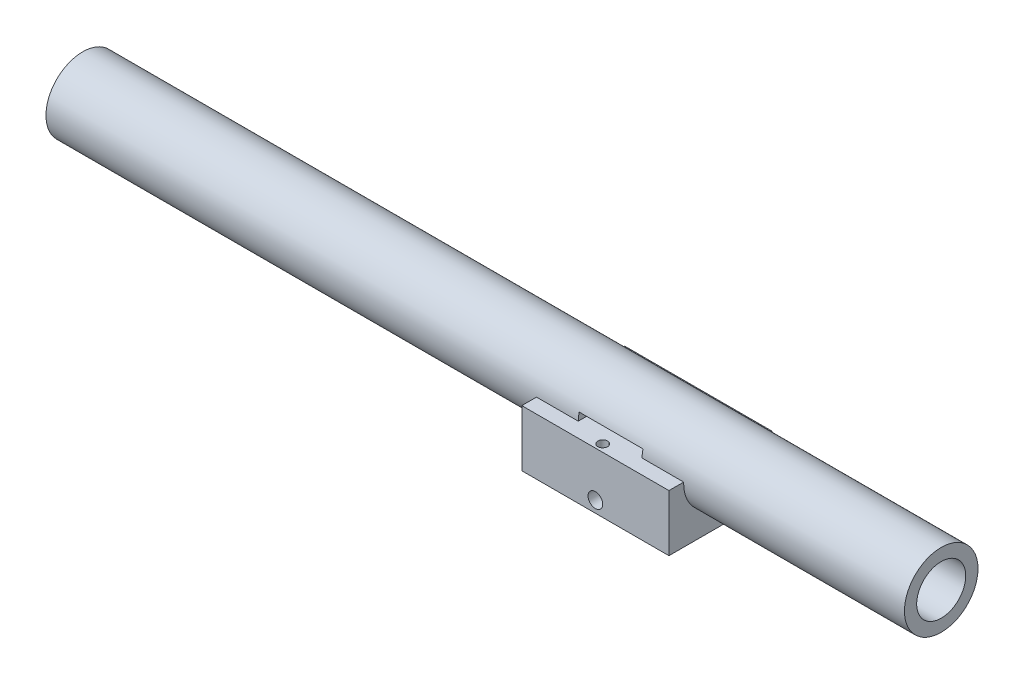
ISO-10303-21;
HEADER;
FILE_DESCRIPTION(('STEP AP214'),'2;1');
FILE_NAME('part.step','',(''),(''),'','','');
FILE_SCHEMA(('AUTOMOTIVE_DESIGN { 1 0 10303 214 1 1 1 1 }'));
ENDSEC;
DATA;
#1=APPLICATION_CONTEXT('core data for automotive mechanical design processes');
#2=APPLICATION_PROTOCOL_DEFINITION('international standard','automotive_design',2000,#1);
#3=PRODUCT_CONTEXT('',#1,'mechanical');
#4=PRODUCT('Part','Part','',(#3));
#5=PRODUCT_RELATED_PRODUCT_CATEGORY('part','',(#4));
#6=PRODUCT_DEFINITION_FORMATION('','',#4);
#7=PRODUCT_DEFINITION_CONTEXT('part definition',#1,'design');
#8=PRODUCT_DEFINITION('design','',#6,#7);
#9=PRODUCT_DEFINITION_SHAPE('','',#8);
#10=(LENGTH_UNIT() NAMED_UNIT(*) SI_UNIT(.MILLI.,.METRE.));
#11=(NAMED_UNIT(*) PLANE_ANGLE_UNIT() SI_UNIT($,.RADIAN.));
#12=(NAMED_UNIT(*) SI_UNIT($,.STERADIAN.) SOLID_ANGLE_UNIT());
#13=UNCERTAINTY_MEASURE_WITH_UNIT(LENGTH_MEASURE(1.E-05),#10,'distance_accuracy_value','');
#14=(GEOMETRIC_REPRESENTATION_CONTEXT(3) GLOBAL_UNCERTAINTY_ASSIGNED_CONTEXT((#13)) GLOBAL_UNIT_ASSIGNED_CONTEXT((#10,
#11,#12)) REPRESENTATION_CONTEXT('',''));
#15=CARTESIAN_POINT('',(0.,0.,0.));
#16=DIRECTION('',(0.,0.,1.));
#17=DIRECTION('',(1.,0.,0.));
#18=AXIS2_PLACEMENT_3D('',#15,#16,#17);
#19=CARTESIAN_POINT('',(44.45,15.0494836321337,37.2907559026321));
#20=DIRECTION('',(1.,0.,0.));
#21=DIRECTION('',(0.,0.,-1.));
#22=AXIS2_PLACEMENT_3D('',#19,#20,#21);
#23=PLANE('',#22);
#24=CARTESIAN_POINT('',(44.45,15.0494836321337,37.2907559026321));
#25=DIRECTION('',(1.,0.,0.));
#26=DIRECTION('',(0.,0.,-1.));
#27=AXIS2_PLACEMENT_3D('',#24,#25,#26);
#28=CIRCLE('',#27,1.90500000000001);
#29=CARTESIAN_POINT('',(44.45,15.0494836321337,35.3857559026321));
#30=VERTEX_POINT('',#29);
#31=EDGE_CURVE('E152',#30,#30,#28,.T.);
#32=ORIENTED_EDGE('',*,*,#31,.T.);
#33=EDGE_LOOP('',(#32));
#34=FACE_BOUND('',#33,.T.);
#35=CARTESIAN_POINT('',(44.45,15.0494836321337,37.2907559026321));
#36=DIRECTION('',(1.,0.,0.));
#37=DIRECTION('',(0.,0.,-1.));
#38=AXIS2_PLACEMENT_3D('',#35,#36,#37);
#39=CIRCLE('',#38,1.27);
#40=CARTESIAN_POINT('',(44.45,15.0494836321337,36.0207559026321));
#41=VERTEX_POINT('',#40);
#42=EDGE_CURVE('E146',#41,#41,#39,.T.);
#43=ORIENTED_EDGE('',*,*,#42,.F.);
#44=EDGE_LOOP('',(#43));
#45=FACE_BOUND('',#44,.T.);
#46=ADVANCED_FACE('F32',(#34,#45),#23,.T.);
#47=CARTESIAN_POINT('',(0.,15.0494836321337,37.2907559026321));
#48=DIRECTION('',(1.,0.,0.));
#49=DIRECTION('',(0.,0.,-1.));
#50=AXIS2_PLACEMENT_3D('',#47,#48,#49);
#51=PLANE('',#50);
#52=CARTESIAN_POINT('',(0.,15.0494836321337,37.2907559026321));
#53=DIRECTION('',(1.,0.,0.));
#54=DIRECTION('',(0.,0.,-1.));
#55=AXIS2_PLACEMENT_3D('',#52,#53,#54);
#56=CIRCLE('',#55,1.90500000000001);
#57=CARTESIAN_POINT('',(0.,15.0494836321337,35.3857559026321));
#58=VERTEX_POINT('',#57);
#59=EDGE_CURVE('E149',#58,#58,#56,.T.);
#60=ORIENTED_EDGE('',*,*,#59,.F.);
#61=EDGE_LOOP('',(#60));
#62=FACE_BOUND('',#61,.T.);
#63=CARTESIAN_POINT('',(0.,15.0494836321337,37.2907559026321));
#64=DIRECTION('',(1.,0.,0.));
#65=DIRECTION('',(0.,0.,-1.));
#66=AXIS2_PLACEMENT_3D('',#63,#64,#65);
#67=CIRCLE('',#66,1.27);
#68=CARTESIAN_POINT('',(0.,15.0494836321337,36.0207559026321));
#69=VERTEX_POINT('',#68);
#70=EDGE_CURVE('E145',#69,#69,#67,.T.);
#71=ORIENTED_EDGE('',*,*,#70,.T.);
#72=EDGE_LOOP('',(#71));
#73=FACE_BOUND('',#72,.T.);
#74=ADVANCED_FACE('F232',(#62,#73),#51,.F.);
#75=CARTESIAN_POINT('',(44.45,15.0494836321337,37.2907559026321));
#76=DIRECTION('',(-1.,0.,0.));
#77=DIRECTION('',(0.,0.,1.));
#78=AXIS2_PLACEMENT_3D('',#75,#76,#77);
#79=CYLINDRICAL_SURFACE('',#78,1.90500000000001);
#80=DIRECTION('',(-1.,0.,0.));
#81=VECTOR('',#80,1.);
#82=CARTESIAN_POINT('',(44.45,15.1201343526344,39.1944453404588));
#83=LINE('',#82,#81);
#84=CARTESIAN_POINT('',(25.4,15.1201343526344,39.1944453404588));
#85=VERTEX_POINT('',#84);
#86=CARTESIAN_POINT('',(27.559,15.1201343526344,39.1944453404588));
#87=VERTEX_POINT('',#86);
#88=EDGE_CURVE('E130',#85,#87,#83,.F.);
#89=ORIENTED_EDGE('',*,*,#88,.T.);
#90=CARTESIAN_POINT('',(27.559,15.0494836321337,37.2907559026321));
#91=DIRECTION('',(-1.,0.,0.));
#92=DIRECTION('',(0.,0.,1.));
#93=AXIS2_PLACEMENT_3D('',#90,#91,#92);
#94=CIRCLE('',#93,1.90500000000001);
#95=CARTESIAN_POINT('',(27.559,15.5011343526344,39.1414413504247));
#96=VERTEX_POINT('',#95);
#97=EDGE_CURVE('E162',#87,#96,#94,.T.);
#98=ORIENTED_EDGE('',*,*,#97,.T.);
#99=DIRECTION('',(-1.,0.,0.));
#100=VECTOR('',#99,1.);
#101=CARTESIAN_POINT('',(44.45,15.5011343526344,39.1414413504247));
#102=LINE('',#101,#100);
#103=CARTESIAN_POINT('',(30.861,15.5011343526344,39.1414413504247));
#104=VERTEX_POINT('',#103);
#105=EDGE_CURVE('E123',#96,#104,#102,.F.);
#106=ORIENTED_EDGE('',*,*,#105,.T.);
#107=CARTESIAN_POINT('',(30.861,15.0494836321337,37.2907559026321));
#108=DIRECTION('',(1.,0.,0.));
#109=DIRECTION('',(0.,1.,0.));
#110=AXIS2_PLACEMENT_3D('',#107,#108,#109);
#111=CIRCLE('',#110,1.90500000000001);
#112=CARTESIAN_POINT('',(30.861,15.1201343526344,39.1944453404588));
#113=VERTEX_POINT('',#112);
#114=EDGE_CURVE('E108',#104,#113,#111,.T.);
#115=ORIENTED_EDGE('',*,*,#114,.T.);
#116=CARTESIAN_POINT('',(33.02,15.1201343526344,39.1944453404588));
#117=VERTEX_POINT('',#116);
#118=EDGE_CURVE('E120',#113,#117,#83,.F.);
#119=ORIENTED_EDGE('',*,*,#118,.T.);
#120=CARTESIAN_POINT('',(33.02,15.0494836321337,37.2907559026321));
#121=DIRECTION('',(-1.,0.,0.));
#122=DIRECTION('',(0.,0.,1.));
#123=AXIS2_PLACEMENT_3D('',#120,#121,#122);
#124=CIRCLE('',#123,1.90500000000001);
#125=CARTESIAN_POINT('',(33.02,15.1201343526344,35.3870664648055));
#126=VERTEX_POINT('',#125);
#127=EDGE_CURVE('E143',#126,#117,#124,.T.);
#128=ORIENTED_EDGE('',*,*,#127,.F.);
#129=DIRECTION('',(-1.,0.,0.));
#130=VECTOR('',#129,1.);
#131=CARTESIAN_POINT('',(44.45,15.1201343526344,35.3870664648055));
#132=LINE('',#131,#130);
#133=CARTESIAN_POINT('',(25.4,15.1201343526344,35.3870664648055));
#134=VERTEX_POINT('',#133);
#135=EDGE_CURVE('E133',#126,#134,#132,.T.);
#136=ORIENTED_EDGE('',*,*,#135,.T.);
#137=CARTESIAN_POINT('',(25.4,15.0494836321337,37.2907559026321));
#138=DIRECTION('',(-1.,0.,0.));
#139=DIRECTION('',(0.,-1.,0.));
#140=AXIS2_PLACEMENT_3D('',#137,#138,#139);
#141=CIRCLE('',#140,1.90500000000001);
#142=EDGE_CURVE('E140',#134,#85,#141,.T.);
#143=ORIENTED_EDGE('',*,*,#142,.T.);
#144=EDGE_LOOP('',(#89,#98,#106,#115,#119,#128,#136,#143));
#145=FACE_BOUND('',#144,.T.);
#146=ORIENTED_EDGE('',*,*,#31,.F.);
#147=EDGE_LOOP('',(#146));
#148=FACE_BOUND('',#147,.T.);
#149=ORIENTED_EDGE('',*,*,#59,.T.);
#150=EDGE_LOOP('',(#149));
#151=FACE_BOUND('',#150,.T.);
#152=ADVANCED_FACE('F34',(#145,#148,#151),#79,.T.);
#153=CARTESIAN_POINT('',(44.45,15.0494836321337,37.2907559026321));
#154=DIRECTION('',(-1.,0.,0.));
#155=DIRECTION('',(0.,0.,1.));
#156=AXIS2_PLACEMENT_3D('',#153,#154,#155);
#157=CYLINDRICAL_SURFACE('',#156,1.27);
#158=CARTESIAN_POINT('',(27.559,15.0494836321337,37.2907559026321));
#159=DIRECTION('',(-1.,0.,0.));
#160=DIRECTION('',(0.,0.,1.));
#161=AXIS2_PLACEMENT_3D('',#158,#159,#160);
#162=CIRCLE('',#161,1.27);
#163=CARTESIAN_POINT('',(27.559,15.1201343526344,38.558789212799));
#164=VERTEX_POINT('',#163);
#165=CARTESIAN_POINT('',(27.559,15.5011343526344,38.4777317350193));
#166=VERTEX_POINT('',#165);
#167=EDGE_CURVE('E124',#164,#166,#162,.T.);
#168=ORIENTED_EDGE('',*,*,#167,.F.);
#169=DIRECTION('',(-1.,0.,0.));
#170=VECTOR('',#169,1.);
#171=CARTESIAN_POINT('',(44.45,15.1201343526344,38.558789212799));
#172=LINE('',#171,#170);
#173=CARTESIAN_POINT('',(30.861,15.1201343526344,38.558789212799));
#174=VERTEX_POINT('',#173);
#175=EDGE_CURVE('E40',#174,#164,#172,.T.);
#176=ORIENTED_EDGE('',*,*,#175,.F.);
#177=CARTESIAN_POINT('',(30.861,15.0494836321337,37.2907559026321));
#178=DIRECTION('',(1.,0.,0.));
#179=DIRECTION('',(0.,1.,0.));
#180=AXIS2_PLACEMENT_3D('',#177,#178,#179);
#181=CIRCLE('',#180,1.27);
#182=CARTESIAN_POINT('',(30.861,15.5011343526344,38.4777317350193));
#183=VERTEX_POINT('',#182);
#184=EDGE_CURVE('E111',#183,#174,#181,.T.);
#185=ORIENTED_EDGE('',*,*,#184,.F.);
#186=DIRECTION('',(-1.,0.,0.));
#187=VECTOR('',#186,1.);
#188=CARTESIAN_POINT('',(44.45,15.5011343526344,38.4777317350193));
#189=LINE('',#188,#187);
#190=EDGE_CURVE('E11',#166,#183,#189,.F.);
#191=ORIENTED_EDGE('',*,*,#190,.F.);
#192=EDGE_LOOP('',(#168,#176,#185,#191));
#193=FACE_BOUND('',#192,.T.);
#194=ORIENTED_EDGE('',*,*,#42,.T.);
#195=EDGE_LOOP('',(#194));
#196=FACE_BOUND('',#195,.T.);
#197=ORIENTED_EDGE('',*,*,#70,.F.);
#198=EDGE_LOOP('',(#197));
#199=FACE_BOUND('',#198,.T.);
#200=ADVANCED_FACE('F166',(#193,#196,#199),#157,.F.);
#201=CARTESIAN_POINT('',(32.385,15.1201343526344,34.6237559026321));
#202=DIRECTION('',(0.,1.,0.));
#203=DIRECTION('',(0.,0.,1.));
#204=AXIS2_PLACEMENT_3D('',#201,#202,#203);
#205=PLANE('',#204);
#206=ORIENTED_EDGE('',*,*,#135,.F.);
#207=DIRECTION('',(0.,0.,1.));
#208=VECTOR('',#207,1.);
#209=CARTESIAN_POINT('',(33.02,15.1201343526344,34.6237559026321));
#210=LINE('',#209,#208);
#211=CARTESIAN_POINT('',(33.02,15.1201343526344,34.6237559026321));
#212=VERTEX_POINT('',#211);
#213=EDGE_CURVE('E131',#212,#126,#210,.T.);
#214=ORIENTED_EDGE('',*,*,#213,.F.);
#215=DIRECTION('',(1.,0.,0.));
#216=VECTOR('',#215,1.);
#217=CARTESIAN_POINT('',(32.385,15.1201343526344,34.6237559026321));
#218=LINE('',#217,#216);
#219=CARTESIAN_POINT('',(25.4,15.1201343526344,34.6237559026321));
#220=VERTEX_POINT('',#219);
#221=EDGE_CURVE('E184',#220,#212,#218,.T.);
#222=ORIENTED_EDGE('',*,*,#221,.F.);
#223=DIRECTION('',(0.,0.,1.));
#224=VECTOR('',#223,1.);
#225=CARTESIAN_POINT('',(25.4,15.1201343526344,34.6237559026321));
#226=LINE('',#225,#224);
#227=EDGE_CURVE('E196',#220,#134,#226,.T.);
#228=ORIENTED_EDGE('',*,*,#227,.T.);
#229=EDGE_LOOP('',(#206,#214,#222,#228));
#230=FACE_BOUND('',#229,.T.);
#231=ADVANCED_FACE('F217',(#230),#205,.T.);
#232=CARTESIAN_POINT('',(29.21,15.1201343526344,39.5767559026322));
#233=DIRECTION('',(0.,1.,0.));
#234=DIRECTION('',(0.,0.,1.));
#235=AXIS2_PLACEMENT_3D('',#232,#233,#234);
#236=CIRCLE('',#235,0.254000000000002);
#237=CARTESIAN_POINT('',(29.21,15.1201343526344,39.8307559026321));
#238=VERTEX_POINT('',#237);
#239=EDGE_CURVE('E395',#238,#238,#236,.T.);
#240=ORIENTED_EDGE('',*,*,#239,.F.);
#241=EDGE_LOOP('',(#240));
#242=FACE_BOUND('',#241,.T.);
#243=ORIENTED_EDGE('',*,*,#118,.F.);
#244=DIRECTION('',(0.,0.,1.));
#245=VECTOR('',#244,1.);
#246=CARTESIAN_POINT('',(30.861,15.1201343526344,38.1797559026322));
#247=LINE('',#246,#245);
#248=EDGE_CURVE('E47',#174,#113,#247,.T.);
#249=ORIENTED_EDGE('',*,*,#248,.F.);
#250=ORIENTED_EDGE('',*,*,#175,.T.);
#251=DIRECTION('',(0.,0.,1.));
#252=VECTOR('',#251,1.);
#253=CARTESIAN_POINT('',(27.559,15.1201343526344,38.1797559026322));
#254=LINE('',#253,#252);
#255=EDGE_CURVE('E53',#164,#87,#254,.T.);
#256=ORIENTED_EDGE('',*,*,#255,.T.);
#257=ORIENTED_EDGE('',*,*,#88,.F.);
#258=CARTESIAN_POINT('',(25.4,15.1201343526344,39.9577559026321));
#259=VERTEX_POINT('',#258);
#260=EDGE_CURVE('E195',#85,#259,#226,.T.);
#261=ORIENTED_EDGE('',*,*,#260,.T.);
#262=DIRECTION('',(1.,0.,0.));
#263=VECTOR('',#262,1.);
#264=CARTESIAN_POINT('',(32.385,15.1201343526344,39.9577559026321));
#265=LINE('',#264,#263);
#266=CARTESIAN_POINT('',(33.02,15.1201343526344,39.9577559026321));
#267=VERTEX_POINT('',#266);
#268=EDGE_CURVE('E173',#259,#267,#265,.T.);
#269=ORIENTED_EDGE('',*,*,#268,.T.);
#270=EDGE_CURVE('E128',#117,#267,#210,.T.);
#271=ORIENTED_EDGE('',*,*,#270,.F.);
#272=EDGE_LOOP('',(#243,#249,#250,#256,#257,#261,#269,#271));
#273=FACE_BOUND('',#272,.T.);
#274=ADVANCED_FACE('F126',(#242,#273),#205,.T.);
#275=CARTESIAN_POINT('',(33.02,15.1201343526344,34.6237559026321));
#276=DIRECTION('',(-1.,0.,0.));
#277=DIRECTION('',(0.,0.,1.));
#278=AXIS2_PLACEMENT_3D('',#275,#276,#277);
#279=PLANE('',#278);
#280=ORIENTED_EDGE('',*,*,#213,.T.);
#281=ORIENTED_EDGE('',*,*,#127,.T.);
#282=ORIENTED_EDGE('',*,*,#270,.T.);
#283=DIRECTION('',(0.,-1.,0.));
#284=VECTOR('',#283,1.);
#285=CARTESIAN_POINT('',(33.02,15.1201343526344,39.9577559026321));
#286=LINE('',#285,#284);
#287=CARTESIAN_POINT('',(33.02,12.1991343526344,39.9577559026321));
#288=VERTEX_POINT('',#287);
#289=EDGE_CURVE('E175',#267,#288,#286,.T.);
#290=ORIENTED_EDGE('',*,*,#289,.T.);
#291=DIRECTION('',(0.,0.,1.));
#292=VECTOR('',#291,1.);
#293=CARTESIAN_POINT('',(33.02,12.1991343526344,34.6237559026321));
#294=LINE('',#293,#292);
#295=CARTESIAN_POINT('',(33.02,12.1991343526344,34.6237559026321));
#296=VERTEX_POINT('',#295);
#297=EDGE_CURVE('E200',#296,#288,#294,.T.);
#298=ORIENTED_EDGE('',*,*,#297,.F.);
#299=DIRECTION('',(0.,-1.,0.));
#300=VECTOR('',#299,1.);
#301=CARTESIAN_POINT('',(33.02,15.1201343526344,34.6237559026321));
#302=LINE('',#301,#300);
#303=EDGE_CURVE('E187',#212,#296,#302,.T.);
#304=ORIENTED_EDGE('',*,*,#303,.F.);
#305=EDGE_LOOP('',(#280,#281,#282,#290,#298,#304));
#306=FACE_BOUND('',#305,.T.);
#307=ADVANCED_FACE('F206',(#306),#279,.F.);
#308=CARTESIAN_POINT('',(25.4,12.1991343526344,34.6237559026321));
#309=DIRECTION('',(0.,-1.,0.));
#310=DIRECTION('',(0.,0.,-1.));
#311=AXIS2_PLACEMENT_3D('',#308,#309,#310);
#312=PLANE('',#311);
#313=ORIENTED_EDGE('',*,*,#297,.T.);
#314=DIRECTION('',(1.,0.,0.));
#315=VECTOR('',#314,1.);
#316=CARTESIAN_POINT('',(25.4,12.1991343526344,39.9577559026321));
#317=LINE('',#316,#315);
#318=CARTESIAN_POINT('',(25.4,12.1991343526344,39.9577559026321));
#319=VERTEX_POINT('',#318);
#320=EDGE_CURVE('E178',#319,#288,#317,.T.);
#321=ORIENTED_EDGE('',*,*,#320,.F.);
#322=DIRECTION('',(0.,0.,1.));
#323=VECTOR('',#322,1.);
#324=CARTESIAN_POINT('',(25.4,12.1991343526344,34.6237559026321));
#325=LINE('',#324,#323);
#326=CARTESIAN_POINT('',(25.4,12.1991343526344,34.6237559026321));
#327=VERTEX_POINT('',#326);
#328=EDGE_CURVE('E199',#327,#319,#325,.T.);
#329=ORIENTED_EDGE('',*,*,#328,.F.);
#330=DIRECTION('',(1.,0.,0.));
#331=VECTOR('',#330,1.);
#332=CARTESIAN_POINT('',(25.4,12.1991343526344,34.6237559026321));
#333=LINE('',#332,#331);
#334=EDGE_CURVE('E189',#327,#296,#333,.T.);
#335=ORIENTED_EDGE('',*,*,#334,.T.);
#336=EDGE_LOOP('',(#313,#321,#329,#335));
#337=FACE_BOUND('',#336,.T.);
#338=ADVANCED_FACE('F222',(#337),#312,.T.);
#339=CARTESIAN_POINT('',(25.4,15.1201343526344,34.6237559026321));
#340=DIRECTION('',(-1.,0.,0.));
#341=DIRECTION('',(0.,-1.,0.));
#342=AXIS2_PLACEMENT_3D('',#339,#340,#341);
#343=PLANE('',#342);
#344=ORIENTED_EDGE('',*,*,#142,.F.);
#345=ORIENTED_EDGE('',*,*,#227,.F.);
#346=DIRECTION('',(0.,-1.,0.));
#347=VECTOR('',#346,1.);
#348=CARTESIAN_POINT('',(25.4,15.1201343526344,34.6237559026321));
#349=LINE('',#348,#347);
#350=EDGE_CURVE('E192',#220,#327,#349,.T.);
#351=ORIENTED_EDGE('',*,*,#350,.T.);
#352=ORIENTED_EDGE('',*,*,#328,.T.);
#353=DIRECTION('',(0.,-1.,0.));
#354=VECTOR('',#353,1.);
#355=CARTESIAN_POINT('',(25.4,15.1201343526344,39.9577559026321));
#356=LINE('',#355,#354);
#357=EDGE_CURVE('E181',#259,#319,#356,.T.);
#358=ORIENTED_EDGE('',*,*,#357,.F.);
#359=ORIENTED_EDGE('',*,*,#260,.F.);
#360=EDGE_LOOP('',(#344,#345,#351,#352,#358,#359));
#361=FACE_BOUND('',#360,.T.);
#362=ADVANCED_FACE('F213',(#361),#343,.T.);
#363=CARTESIAN_POINT('',(0.,0.,34.6237559026321));
#364=DIRECTION('',(0.,0.,-1.));
#365=DIRECTION('',(-1.,0.,0.));
#366=AXIS2_PLACEMENT_3D('',#363,#364,#365);
#367=PLANE('',#366);
#368=CARTESIAN_POINT('',(29.21,12.7896843526344,34.6237559026321));
#369=DIRECTION('',(0.,0.,-1.));
#370=DIRECTION('',(-1.,0.,0.));
#371=AXIS2_PLACEMENT_3D('',#368,#369,#370);
#372=CIRCLE('',#371,0.380999999999998);
#373=CARTESIAN_POINT('',(28.829,12.7896843526344,34.6237559026321));
#374=VERTEX_POINT('',#373);
#375=EDGE_CURVE('E163',#374,#374,#372,.T.);
#376=ORIENTED_EDGE('',*,*,#375,.F.);
#377=EDGE_LOOP('',(#376));
#378=FACE_BOUND('',#377,.T.);
#379=ORIENTED_EDGE('',*,*,#221,.T.);
#380=ORIENTED_EDGE('',*,*,#303,.T.);
#381=ORIENTED_EDGE('',*,*,#334,.F.);
#382=ORIENTED_EDGE('',*,*,#350,.F.);
#383=EDGE_LOOP('',(#379,#380,#381,#382));
#384=FACE_BOUND('',#383,.T.);
#385=ADVANCED_FACE('F221',(#378,#384),#367,.T.);
#386=CARTESIAN_POINT('',(0.,0.,39.9577559026321));
#387=DIRECTION('',(0.,0.,-1.));
#388=DIRECTION('',(-1.,0.,0.));
#389=AXIS2_PLACEMENT_3D('',#386,#387,#388);
#390=PLANE('',#389);
#391=CARTESIAN_POINT('',(29.21,12.7896843526344,39.9577559026321));
#392=DIRECTION('',(0.,0.,1.));
#393=DIRECTION('',(1.,0.,0.));
#394=AXIS2_PLACEMENT_3D('',#391,#392,#393);
#395=CIRCLE('',#394,0.380999999999998);
#396=CARTESIAN_POINT('',(29.591,12.7896843526344,39.9577559026321));
#397=VERTEX_POINT('',#396);
#398=EDGE_CURVE('E400',#397,#397,#395,.T.);
#399=ORIENTED_EDGE('',*,*,#398,.F.);
#400=EDGE_LOOP('',(#399));
#401=FACE_BOUND('',#400,.T.);
#402=ORIENTED_EDGE('',*,*,#268,.F.);
#403=ORIENTED_EDGE('',*,*,#357,.T.);
#404=ORIENTED_EDGE('',*,*,#320,.T.);
#405=ORIENTED_EDGE('',*,*,#289,.F.);
#406=EDGE_LOOP('',(#402,#403,#404,#405));
#407=FACE_BOUND('',#406,.T.);
#408=ADVANCED_FACE('F209',(#401,#407),#390,.F.);
#409=CARTESIAN_POINT('',(27.559,15.5011343526344,38.1797559026322));
#410=DIRECTION('',(0.,1.,0.));
#411=DIRECTION('',(0.,0.,1.));
#412=AXIS2_PLACEMENT_3D('',#409,#410,#411);
#413=PLANE('',#412);
#414=DIRECTION('',(0.,0.,1.));
#415=VECTOR('',#414,1.);
#416=CARTESIAN_POINT('',(27.559,15.5011343526344,38.1797559026322));
#417=LINE('',#416,#415);
#418=EDGE_CURVE('E407',#166,#96,#417,.T.);
#419=ORIENTED_EDGE('',*,*,#418,.F.);
#420=ORIENTED_EDGE('',*,*,#190,.T.);
#421=DIRECTION('',(0.,0.,1.));
#422=VECTOR('',#421,1.);
#423=CARTESIAN_POINT('',(30.861,15.5011343526344,38.1797559026322));
#424=LINE('',#423,#422);
#425=EDGE_CURVE('E113',#183,#104,#424,.T.);
#426=ORIENTED_EDGE('',*,*,#425,.T.);
#427=ORIENTED_EDGE('',*,*,#105,.F.);
#428=EDGE_LOOP('',(#419,#420,#426,#427));
#429=FACE_BOUND('',#428,.T.);
#430=ADVANCED_FACE('F297',(#429),#413,.F.);
#431=CARTESIAN_POINT('',(27.559,15.5011343526344,38.1797559026322));
#432=DIRECTION('',(-1.,0.,0.));
#433=DIRECTION('',(0.,0.,1.));
#434=AXIS2_PLACEMENT_3D('',#431,#432,#433);
#435=PLANE('',#434);
#436=ORIENTED_EDGE('',*,*,#255,.F.);
#437=ORIENTED_EDGE('',*,*,#167,.T.);
#438=ORIENTED_EDGE('',*,*,#418,.T.);
#439=ORIENTED_EDGE('',*,*,#97,.F.);
#440=EDGE_LOOP('',(#436,#437,#438,#439));
#441=FACE_BOUND('',#440,.T.);
#442=ADVANCED_FACE('F159',(#441),#435,.F.);
#443=CARTESIAN_POINT('',(30.861,15.5011343526344,38.1797559026322));
#444=DIRECTION('',(1.,0.,0.));
#445=DIRECTION('',(0.,1.,0.));
#446=AXIS2_PLACEMENT_3D('',#443,#444,#445);
#447=PLANE('',#446);
#448=ORIENTED_EDGE('',*,*,#425,.F.);
#449=ORIENTED_EDGE('',*,*,#184,.T.);
#450=ORIENTED_EDGE('',*,*,#248,.T.);
#451=ORIENTED_EDGE('',*,*,#114,.F.);
#452=EDGE_LOOP('',(#448,#449,#450,#451));
#453=FACE_BOUND('',#452,.T.);
#454=ADVANCED_FACE('F107',(#453),#447,.F.);
#455=CARTESIAN_POINT('',(29.21,12.7896843526344,34.3697559026322));
#456=DIRECTION('',(0.,0.,1.));
#457=DIRECTION('',(1.,0.,0.));
#458=AXIS2_PLACEMENT_3D('',#455,#456,#457);
#459=CYLINDRICAL_SURFACE('',#458,0.380999999999998);
#460=ORIENTED_EDGE('',*,*,#375,.T.);
#461=EDGE_LOOP('',(#460));
#462=FACE_BOUND('',#461,.T.);
#463=ORIENTED_EDGE('',*,*,#398,.T.);
#464=EDGE_LOOP('',(#463));
#465=FACE_BOUND('',#464,.T.);
#466=ADVANCED_FACE('F318',(#462,#465),#459,.F.);
#467=CARTESIAN_POINT('',(29.21,13.8501343526344,39.5767559026322));
#468=DIRECTION('',(0.,1.,0.));
#469=DIRECTION('',(0.,0.,1.));
#470=AXIS2_PLACEMENT_3D('',#467,#468,#469);
#471=CYLINDRICAL_SURFACE('',#470,0.254000000000002);
#472=CARTESIAN_POINT('',(29.21,13.8501343526344,39.5767559026322));
#473=DIRECTION('',(0.,1.,0.));
#474=DIRECTION('',(0.,0.,1.));
#475=AXIS2_PLACEMENT_3D('',#472,#473,#474);
#476=CIRCLE('',#475,0.254000000000002);
#477=CARTESIAN_POINT('',(29.21,13.8501343526344,39.8307559026321));
#478=VERTEX_POINT('',#477);
#479=EDGE_CURVE('E397',#478,#478,#476,.T.);
#480=ORIENTED_EDGE('',*,*,#479,.F.);
#481=EDGE_LOOP('',(#480));
#482=FACE_BOUND('',#481,.T.);
#483=ORIENTED_EDGE('',*,*,#239,.T.);
#484=EDGE_LOOP('',(#483));
#485=FACE_BOUND('',#484,.T.);
#486=ADVANCED_FACE('F324',(#482,#485),#471,.F.);
#487=CARTESIAN_POINT('',(29.21,13.8501343526344,39.5767559026322));
#488=DIRECTION('',(0.,1.,0.));
#489=DIRECTION('',(0.,0.,1.));
#490=AXIS2_PLACEMENT_3D('',#487,#488,#489);
#491=PLANE('',#490);
#492=ORIENTED_EDGE('',*,*,#479,.T.);
#493=EDGE_LOOP('',(#492));
#494=FACE_BOUND('',#493,.T.);
#495=ADVANCED_FACE('F333',(#494),#491,.T.);
#496=CLOSED_SHELL('',(#46,#74,#152,#200,#231,#274,#307,#338,#362,#385,#408,#430,#442,#454,#466,
#486,#495));
#497=MANIFOLD_SOLID_BREP('B2',#496);
#498=ADVANCED_BREP_SHAPE_REPRESENTATION('',(#18,#497),#14);
#499=SHAPE_DEFINITION_REPRESENTATION(#9,#498);
ENDSEC;
END-ISO-10303-21;
